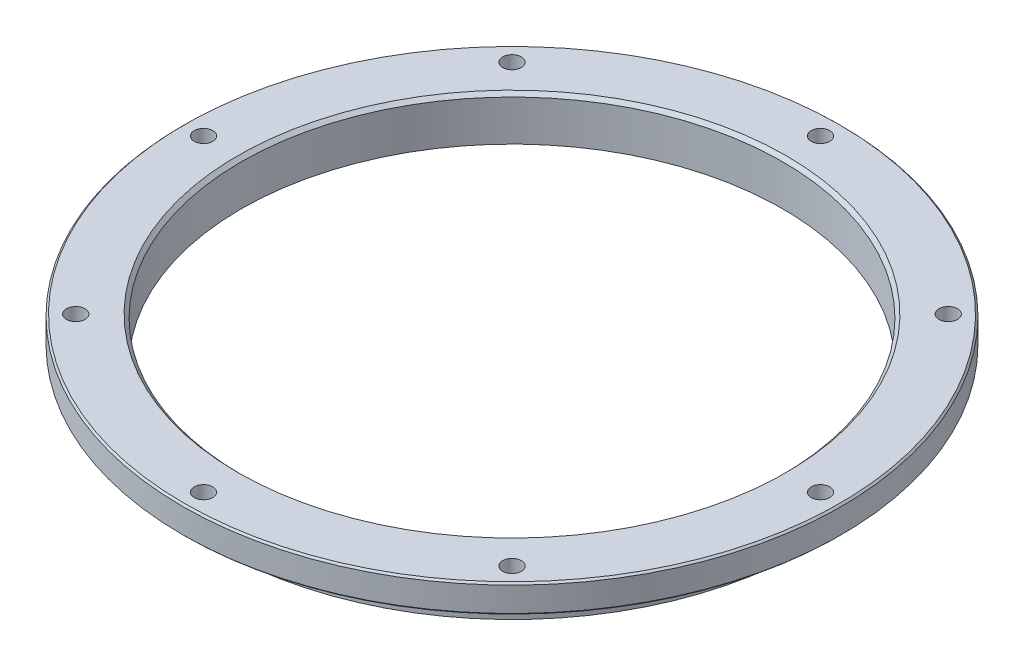
ISO-10303-21;
HEADER;
FILE_DESCRIPTION(('STEP AP214'),'2;1');
FILE_NAME('part.step','',(''),(''),'','','');
FILE_SCHEMA(('AUTOMOTIVE_DESIGN { 1 0 10303 214 1 1 1 1 }'));
ENDSEC;
DATA;
#1=APPLICATION_CONTEXT('core data for automotive mechanical design processes');
#2=APPLICATION_PROTOCOL_DEFINITION('international standard','automotive_design',2000,#1);
#3=PRODUCT_CONTEXT('',#1,'mechanical');
#4=PRODUCT('Part','Part','',(#3));
#5=PRODUCT_RELATED_PRODUCT_CATEGORY('part','',(#4));
#6=PRODUCT_DEFINITION_FORMATION('','',#4);
#7=PRODUCT_DEFINITION_CONTEXT('part definition',#1,'design');
#8=PRODUCT_DEFINITION('design','',#6,#7);
#9=PRODUCT_DEFINITION_SHAPE('','',#8);
#10=(LENGTH_UNIT() NAMED_UNIT(*) SI_UNIT(.MILLI.,.METRE.));
#11=(NAMED_UNIT(*) PLANE_ANGLE_UNIT() SI_UNIT($,.RADIAN.));
#12=(NAMED_UNIT(*) SI_UNIT($,.STERADIAN.) SOLID_ANGLE_UNIT());
#13=UNCERTAINTY_MEASURE_WITH_UNIT(LENGTH_MEASURE(1.E-05),#10,'distance_accuracy_value','');
#14=(GEOMETRIC_REPRESENTATION_CONTEXT(3) GLOBAL_UNCERTAINTY_ASSIGNED_CONTEXT((#13)) GLOBAL_UNIT_ASSIGNED_CONTEXT((#10,
#11,#12)) REPRESENTATION_CONTEXT('',''));
#15=CARTESIAN_POINT('',(0.,0.,0.));
#16=DIRECTION('',(0.,0.,1.));
#17=DIRECTION('',(1.,0.,0.));
#18=AXIS2_PLACEMENT_3D('',#15,#16,#17);
#19=CARTESIAN_POINT('',(-1.384193439547E-12,15.74999507337,-1.021405182655E-12));
#20=DIRECTION('',(0.,-1.,0.));
#21=DIRECTION('',(0.,0.,-1.));
#22=AXIS2_PLACEMENT_3D('',#19,#20,#21);
#23=CONICAL_SURFACE('',#22,93.7499955854,0.785398113577548);
#24=CARTESIAN_POINT('',(0.,15.49999152514,0.));
#25=DIRECTION('',(0.,1.,0.));
#26=DIRECTION('',(1.,0.,0.));
#27=AXIS2_PLACEMENT_3D('',#24,#25,#26);
#28=CIRCLE('',#27,94.);
#29=CARTESIAN_POINT('',(-94.,15.49999152514,0.));
#30=VERTEX_POINT('',#29);
#31=CARTESIAN_POINT('',(-1.39570511940441E-12,15.4999910794989,93.9999995543597));
#32=VERTEX_POINT('',#31);
#33=EDGE_CURVE('E183',#30,#32,#28,.T.);
#34=ORIENTED_EDGE('',*,*,#33,.T.);
#35=DIRECTION('',(0.,0.707106816414536,-0.707106745958557));
#36=VECTOR('',#35,1.);
#37=CARTESIAN_POINT('',(-1.39567450274837E-12,15.74999507337,93.749995585399));
#38=LINE('',#37,#36);
#39=CARTESIAN_POINT('',(-1.39564388603387E-12,15.9999995446702,93.4999911390092));
#40=VERTEX_POINT('',#39);
#41=EDGE_CURVE('E11',#32,#40,#38,.T.);
#42=ORIENTED_EDGE('',*,*,#41,.T.);
#43=CARTESIAN_POINT('',(-1.384178131188E-12,15.99999954467,-1.021405182655E-12));
#44=DIRECTION('',(0.,1.,0.));
#45=DIRECTION('',(1.,0.,0.));
#46=AXIS2_PLACEMENT_3D('',#43,#44,#45);
#47=CIRCLE('',#46,93.49999113901);
#48=EDGE_CURVE('E193',#40,#40,#47,.T.);
#49=ORIENTED_EDGE('',*,*,#48,.F.);
#50=ORIENTED_EDGE('',*,*,#41,.F.);
#51=CARTESIAN_POINT('',(0.,15.49999152514,0.));
#52=DIRECTION('',(0.,1.,0.));
#53=DIRECTION('',(1.,0.,0.));
#54=AXIS2_PLACEMENT_3D('',#51,#52,#53);
#55=CIRCLE('',#54,94.);
#56=EDGE_CURVE('E27',#32,#30,#55,.T.);
#57=ORIENTED_EDGE('',*,*,#56,.T.);
#58=EDGE_LOOP('',(#34,#42,#49,#50,#57));
#59=FACE_BOUND('',#58,.T.);
#60=ADVANCED_FACE('F17',(#59),#23,.T.);
#61=CARTESIAN_POINT('',(0.,-0.8,0.));
#62=DIRECTION('',(0.,1.,0.));
#63=DIRECTION('',(1.,0.,0.));
#64=AXIS2_PLACEMENT_3D('',#61,#62,#63);
#65=CYLINDRICAL_SURFACE('',#64,94.);
#66=ORIENTED_EDGE('',*,*,#33,.F.);
#67=DIRECTION('',(0.,-1.,0.));
#68=VECTOR('',#67,1.);
#69=CARTESIAN_POINT('',(-94.,-0.8,0.));
#70=LINE('',#69,#68);
#71=CARTESIAN_POINT('',(-94.,8.500006914506,0.));
#72=VERTEX_POINT('',#71);
#73=EDGE_CURVE('E252',#30,#72,#70,.T.);
#74=ORIENTED_EDGE('',*,*,#73,.T.);
#75=CARTESIAN_POINT('',(0.,8.500006914506,0.));
#76=DIRECTION('',(0.,1.,0.));
#77=DIRECTION('',(1.,0.,0.));
#78=AXIS2_PLACEMENT_3D('',#75,#76,#77);
#79=CIRCLE('',#78,94.);
#80=CARTESIAN_POINT('',(-1.3114627038843E-12,8.50000721900428,93.999999695505));
#81=VERTEX_POINT('',#80);
#82=EDGE_CURVE('E172',#72,#81,#79,.T.);
#83=ORIENTED_EDGE('',*,*,#82,.T.);
#84=CARTESIAN_POINT('',(0.,8.500006914506,0.));
#85=DIRECTION('',(0.,1.,0.));
#86=DIRECTION('',(1.,0.,0.));
#87=AXIS2_PLACEMENT_3D('',#84,#85,#86);
#88=CIRCLE('',#87,94.);
#89=EDGE_CURVE('E169',#81,#72,#88,.T.);
#90=ORIENTED_EDGE('',*,*,#89,.T.);
#91=ORIENTED_EDGE('',*,*,#73,.F.);
#92=ORIENTED_EDGE('',*,*,#56,.F.);
#93=EDGE_LOOP('',(#66,#74,#83,#90,#91,#92));
#94=FACE_BOUND('',#93,.T.);
#95=ADVANCED_FACE('F379',(#94),#65,.T.);
#96=CARTESIAN_POINT('',(-1.322974383759E-12,8.250003943841,1.284305994886E-12));
#97=DIRECTION('',(0.,1.,0.));
#98=DIRECTION('',(0.,0.,-1.));
#99=AXIS2_PLACEMENT_3D('',#96,#97,#98);
#100=CONICAL_SURFACE('',#99,93.74999644035,0.785398123378794);
#101=ORIENTED_EDGE('',*,*,#82,.F.);
#102=ORIENTED_EDGE('',*,*,#89,.F.);
#103=DIRECTION('',(0.,-0.707106809484009,-0.707106752889085));
#104=VECTOR('',#103,1.);
#105=CARTESIAN_POINT('',(-1.31149332045292E-12,8.250003943841,93.7499964403513));
#106=LINE('',#105,#104);
#107=CARTESIAN_POINT('',(-1.31152393706513E-12,8.00000031281068,93.4999928293306));
#108=VERTEX_POINT('',#107);
#109=EDGE_CURVE('E163',#81,#108,#106,.T.);
#110=ORIENTED_EDGE('',*,*,#109,.T.);
#111=CARTESIAN_POINT('',(-1.322989692066E-12,8.00000031281,1.284305994886E-12));
#112=DIRECTION('',(0.,1.,0.));
#113=DIRECTION('',(1.,0.,0.));
#114=AXIS2_PLACEMENT_3D('',#111,#112,#113);
#115=CIRCLE('',#114,93.49999282933);
#116=EDGE_CURVE('E236',#108,#108,#115,.T.);
#117=ORIENTED_EDGE('',*,*,#116,.T.);
#118=ORIENTED_EDGE('',*,*,#109,.F.);
#119=EDGE_LOOP('',(#101,#102,#110,#117,#118));
#120=FACE_BOUND('',#119,.T.);
#121=ADVANCED_FACE('F377',(#120),#100,.T.);
#122=CARTESIAN_POINT('',(-62.22539674442,16.,62.22539674442));
#123=DIRECTION('',(0.,-1.,0.));
#124=DIRECTION('',(1.,0.,0.));
#125=AXIS2_PLACEMENT_3D('',#122,#123,#124);
#126=CYLINDRICAL_SURFACE('',#125,2.65);
#127=CARTESIAN_POINT('',(-62.22539674442,16.,62.22539674442));
#128=DIRECTION('',(0.,-1.,0.));
#129=DIRECTION('',(1.,0.,0.));
#130=AXIS2_PLACEMENT_3D('',#127,#128,#129);
#131=CIRCLE('',#130,2.65);
#132=CARTESIAN_POINT('',(-64.87539674442,16.,62.22539674442));
#133=VERTEX_POINT('',#132);
#134=EDGE_CURVE('E245',#133,#133,#131,.T.);
#135=ORIENTED_EDGE('',*,*,#134,.F.);
#136=DIRECTION('',(0.,-1.,0.));
#137=VECTOR('',#136,1.);
#138=CARTESIAN_POINT('',(-64.87539674442,16.,62.22539674442));
#139=LINE('',#138,#137);
#140=CARTESIAN_POINT('',(-64.87539674442,8.,62.22539674442));
#141=VERTEX_POINT('',#140);
#142=EDGE_CURVE('E157',#133,#141,#139,.T.);
#143=ORIENTED_EDGE('',*,*,#142,.T.);
#144=CARTESIAN_POINT('',(-62.22539674442,8.,62.22539674442));
#145=DIRECTION('',(0.,-1.,0.));
#146=DIRECTION('',(1.,0.,0.));
#147=AXIS2_PLACEMENT_3D('',#144,#145,#146);
#148=CIRCLE('',#147,2.65);
#149=EDGE_CURVE('E265',#141,#141,#148,.T.);
#150=ORIENTED_EDGE('',*,*,#149,.T.);
#151=ORIENTED_EDGE('',*,*,#142,.F.);
#152=EDGE_LOOP('',(#135,#143,#150,#151));
#153=FACE_BOUND('',#152,.T.);
#154=ADVANCED_FACE('F353',(#153),#126,.F.);
#155=CARTESIAN_POINT('',(-88.,16.,0.));
#156=DIRECTION('',(0.,-1.,0.));
#157=DIRECTION('',(1.,0.,0.));
#158=AXIS2_PLACEMENT_3D('',#155,#156,#157);
#159=CYLINDRICAL_SURFACE('',#158,2.65);
#160=CARTESIAN_POINT('',(-88.,16.,0.));
#161=DIRECTION('',(0.,-1.,0.));
#162=DIRECTION('',(1.,0.,0.));
#163=AXIS2_PLACEMENT_3D('',#160,#161,#162);
#164=CIRCLE('',#163,2.65);
#165=CARTESIAN_POINT('',(-90.65,16.,0.));
#166=VERTEX_POINT('',#165);
#167=EDGE_CURVE('E230',#166,#166,#164,.T.);
#168=ORIENTED_EDGE('',*,*,#167,.F.);
#169=DIRECTION('',(0.,-1.,0.));
#170=VECTOR('',#169,1.);
#171=CARTESIAN_POINT('',(-90.65,16.,0.));
#172=LINE('',#171,#170);
#173=CARTESIAN_POINT('',(-90.65,8.,0.));
#174=VERTEX_POINT('',#173);
#175=EDGE_CURVE('E149',#166,#174,#172,.T.);
#176=ORIENTED_EDGE('',*,*,#175,.T.);
#177=CARTESIAN_POINT('',(-88.,8.,0.));
#178=DIRECTION('',(0.,-1.,0.));
#179=DIRECTION('',(1.,0.,0.));
#180=AXIS2_PLACEMENT_3D('',#177,#178,#179);
#181=CIRCLE('',#180,2.65);
#182=EDGE_CURVE('E285',#174,#174,#181,.T.);
#183=ORIENTED_EDGE('',*,*,#182,.T.);
#184=ORIENTED_EDGE('',*,*,#175,.F.);
#185=EDGE_LOOP('',(#168,#176,#183,#184));
#186=FACE_BOUND('',#185,.T.);
#187=ADVANCED_FACE('F386',(#186),#159,.F.);
#188=CARTESIAN_POINT('',(-62.22539674442,16.,-62.22539674442));
#189=DIRECTION('',(0.,-1.,0.));
#190=DIRECTION('',(1.,0.,0.));
#191=AXIS2_PLACEMENT_3D('',#188,#189,#190);
#192=CYLINDRICAL_SURFACE('',#191,2.65);
#193=CARTESIAN_POINT('',(-62.22539674442,16.,-62.22539674442));
#194=DIRECTION('',(0.,-1.,0.));
#195=DIRECTION('',(1.,0.,0.));
#196=AXIS2_PLACEMENT_3D('',#193,#194,#195);
#197=CIRCLE('',#196,2.65);
#198=CARTESIAN_POINT('',(-64.87539674442,16.,-62.22539674442));
#199=VERTEX_POINT('',#198);
#200=EDGE_CURVE('E147',#199,#199,#197,.T.);
#201=ORIENTED_EDGE('',*,*,#200,.F.);
#202=DIRECTION('',(0.,-1.,0.));
#203=VECTOR('',#202,1.);
#204=CARTESIAN_POINT('',(-64.87539674442,16.,-62.22539674442));
#205=LINE('',#204,#203);
#206=CARTESIAN_POINT('',(-64.87539674442,8.,-62.22539674442));
#207=VERTEX_POINT('',#206);
#208=EDGE_CURVE('E142',#199,#207,#205,.T.);
#209=ORIENTED_EDGE('',*,*,#208,.T.);
#210=CARTESIAN_POINT('',(-62.22539674442,8.,-62.22539674442));
#211=DIRECTION('',(0.,-1.,0.));
#212=DIRECTION('',(1.,0.,0.));
#213=AXIS2_PLACEMENT_3D('',#210,#211,#212);
#214=CIRCLE('',#213,2.65);
#215=EDGE_CURVE('E145',#207,#207,#214,.T.);
#216=ORIENTED_EDGE('',*,*,#215,.T.);
#217=ORIENTED_EDGE('',*,*,#208,.F.);
#218=EDGE_LOOP('',(#201,#209,#216,#217));
#219=FACE_BOUND('',#218,.T.);
#220=ADVANCED_FACE('F143',(#219),#192,.F.);
#221=CARTESIAN_POINT('',(0.,16.,-88.));
#222=DIRECTION('',(0.,-1.,0.));
#223=DIRECTION('',(1.,0.,0.));
#224=AXIS2_PLACEMENT_3D('',#221,#222,#223);
#225=CYLINDRICAL_SURFACE('',#224,2.65);
#226=CARTESIAN_POINT('',(0.,16.,-88.));
#227=DIRECTION('',(0.,-1.,0.));
#228=DIRECTION('',(1.,0.,0.));
#229=AXIS2_PLACEMENT_3D('',#226,#227,#228);
#230=CIRCLE('',#229,2.65);
#231=CARTESIAN_POINT('',(-2.65,16.,-88.));
#232=VERTEX_POINT('',#231);
#233=EDGE_CURVE('E231',#232,#232,#230,.T.);
#234=ORIENTED_EDGE('',*,*,#233,.F.);
#235=DIRECTION('',(0.,-1.,0.));
#236=VECTOR('',#235,1.);
#237=CARTESIAN_POINT('',(-2.65,16.,-88.));
#238=LINE('',#237,#236);
#239=CARTESIAN_POINT('',(-2.65,8.,-88.));
#240=VERTEX_POINT('',#239);
#241=EDGE_CURVE('E150',#232,#240,#238,.T.);
#242=ORIENTED_EDGE('',*,*,#241,.T.);
#243=CARTESIAN_POINT('',(0.,8.,-88.));
#244=DIRECTION('',(0.,-1.,0.));
#245=DIRECTION('',(1.,0.,0.));
#246=AXIS2_PLACEMENT_3D('',#243,#244,#245);
#247=CIRCLE('',#246,2.65);
#248=EDGE_CURVE('E165',#240,#240,#247,.T.);
#249=ORIENTED_EDGE('',*,*,#248,.T.);
#250=ORIENTED_EDGE('',*,*,#241,.F.);
#251=EDGE_LOOP('',(#234,#242,#249,#250));
#252=FACE_BOUND('',#251,.T.);
#253=ADVANCED_FACE('F19',(#252),#225,.F.);
#254=CARTESIAN_POINT('',(62.22539674442,16.,-62.22539674442));
#255=DIRECTION('',(0.,-1.,0.));
#256=DIRECTION('',(1.,0.,0.));
#257=AXIS2_PLACEMENT_3D('',#254,#255,#256);
#258=CYLINDRICAL_SURFACE('',#257,2.65);
#259=CARTESIAN_POINT('',(62.22539674442,16.,-62.22539674442));
#260=DIRECTION('',(0.,-1.,0.));
#261=DIRECTION('',(1.,0.,0.));
#262=AXIS2_PLACEMENT_3D('',#259,#260,#261);
#263=CIRCLE('',#262,2.65);
#264=CARTESIAN_POINT('',(59.57539674442,16.,-62.22539674442));
#265=VERTEX_POINT('',#264);
#266=EDGE_CURVE('E246',#265,#265,#263,.T.);
#267=ORIENTED_EDGE('',*,*,#266,.F.);
#268=DIRECTION('',(0.,-1.,0.));
#269=VECTOR('',#268,1.);
#270=CARTESIAN_POINT('',(59.57539674442,16.,-62.22539674442));
#271=LINE('',#270,#269);
#272=CARTESIAN_POINT('',(59.57539674442,8.,-62.22539674442));
#273=VERTEX_POINT('',#272);
#274=EDGE_CURVE('E159',#265,#273,#271,.T.);
#275=ORIENTED_EDGE('',*,*,#274,.T.);
#276=CARTESIAN_POINT('',(62.22539674442,8.,-62.22539674442));
#277=DIRECTION('',(0.,-1.,0.));
#278=DIRECTION('',(1.,0.,0.));
#279=AXIS2_PLACEMENT_3D('',#276,#277,#278);
#280=CIRCLE('',#279,2.65);
#281=EDGE_CURVE('E168',#273,#273,#280,.T.);
#282=ORIENTED_EDGE('',*,*,#281,.T.);
#283=ORIENTED_EDGE('',*,*,#274,.F.);
#284=EDGE_LOOP('',(#267,#275,#282,#283));
#285=FACE_BOUND('',#284,.T.);
#286=ADVANCED_FACE('F409',(#285),#258,.F.);
#287=CARTESIAN_POINT('',(88.,16.,0.));
#288=DIRECTION('',(0.,-1.,0.));
#289=DIRECTION('',(1.,0.,0.));
#290=AXIS2_PLACEMENT_3D('',#287,#288,#289);
#291=CYLINDRICAL_SURFACE('',#290,2.65);
#292=CARTESIAN_POINT('',(88.,16.,0.));
#293=DIRECTION('',(0.,-1.,0.));
#294=DIRECTION('',(1.,0.,0.));
#295=AXIS2_PLACEMENT_3D('',#292,#293,#294);
#296=CIRCLE('',#295,2.65);
#297=CARTESIAN_POINT('',(85.35,16.,0.));
#298=VERTEX_POINT('',#297);
#299=EDGE_CURVE('E227',#298,#298,#296,.T.);
#300=ORIENTED_EDGE('',*,*,#299,.F.);
#301=DIRECTION('',(0.,-1.,0.));
#302=VECTOR('',#301,1.);
#303=CARTESIAN_POINT('',(85.35,16.,0.));
#304=LINE('',#303,#302);
#305=CARTESIAN_POINT('',(85.35,8.,0.));
#306=VERTEX_POINT('',#305);
#307=EDGE_CURVE('E281',#298,#306,#304,.T.);
#308=ORIENTED_EDGE('',*,*,#307,.T.);
#309=CARTESIAN_POINT('',(88.,8.,0.));
#310=DIRECTION('',(0.,-1.,0.));
#311=DIRECTION('',(1.,0.,0.));
#312=AXIS2_PLACEMENT_3D('',#309,#310,#311);
#313=CIRCLE('',#312,2.65);
#314=EDGE_CURVE('E222',#306,#306,#313,.T.);
#315=ORIENTED_EDGE('',*,*,#314,.T.);
#316=ORIENTED_EDGE('',*,*,#307,.F.);
#317=EDGE_LOOP('',(#300,#308,#315,#316));
#318=FACE_BOUND('',#317,.T.);
#319=ADVANCED_FACE('F412',(#318),#291,.F.);
#320=CARTESIAN_POINT('',(62.22539674442,16.,62.22539674442));
#321=DIRECTION('',(0.,-1.,0.));
#322=DIRECTION('',(1.,0.,0.));
#323=AXIS2_PLACEMENT_3D('',#320,#321,#322);
#324=CYLINDRICAL_SURFACE('',#323,2.65);
#325=CARTESIAN_POINT('',(62.22539674442,16.,62.22539674442));
#326=DIRECTION('',(0.,-1.,0.));
#327=DIRECTION('',(1.,0.,0.));
#328=AXIS2_PLACEMENT_3D('',#325,#326,#327);
#329=CIRCLE('',#328,2.65);
#330=CARTESIAN_POINT('',(59.57539674442,16.,62.22539674442));
#331=VERTEX_POINT('',#330);
#332=EDGE_CURVE('E196',#331,#331,#329,.T.);
#333=ORIENTED_EDGE('',*,*,#332,.F.);
#334=DIRECTION('',(0.,-1.,0.));
#335=VECTOR('',#334,1.);
#336=CARTESIAN_POINT('',(59.57539674442,16.,62.22539674442));
#337=LINE('',#336,#335);
#338=CARTESIAN_POINT('',(59.57539674442,8.,62.22539674442));
#339=VERTEX_POINT('',#338);
#340=EDGE_CURVE('E278',#331,#339,#337,.T.);
#341=ORIENTED_EDGE('',*,*,#340,.T.);
#342=CARTESIAN_POINT('',(62.22539674442,8.,62.22539674442));
#343=DIRECTION('',(0.,-1.,0.));
#344=DIRECTION('',(1.,0.,0.));
#345=AXIS2_PLACEMENT_3D('',#342,#343,#344);
#346=CIRCLE('',#345,2.65);
#347=EDGE_CURVE('E232',#339,#339,#346,.T.);
#348=ORIENTED_EDGE('',*,*,#347,.T.);
#349=ORIENTED_EDGE('',*,*,#340,.F.);
#350=EDGE_LOOP('',(#333,#341,#348,#349));
#351=FACE_BOUND('',#350,.T.);
#352=ADVANCED_FACE('F402',(#351),#324,.F.);
#353=CARTESIAN_POINT('',(0.,0.,0.));
#354=DIRECTION('',(0.,1.,0.));
#355=DIRECTION('',(1.,0.,0.));
#356=AXIS2_PLACEMENT_3D('',#353,#354,#355);
#357=PLANE('',#356);
#358=CARTESIAN_POINT('',(0.,0.,0.));
#359=DIRECTION('',(0.,-1.,0.));
#360=DIRECTION('',(1.,0.,0.));
#361=AXIS2_PLACEMENT_3D('',#358,#359,#360);
#362=CIRCLE('',#361,83.1);
#363=CARTESIAN_POINT('',(83.1,2.53685961126848E-13,0.));
#364=VERTEX_POINT('',#363);
#365=EDGE_CURVE('E218',#364,#364,#362,.T.);
#366=ORIENTED_EDGE('',*,*,#365,.F.);
#367=EDGE_LOOP('',(#366));
#368=FACE_BOUND('',#367,.T.);
#369=CARTESIAN_POINT('',(0.,0.,0.));
#370=DIRECTION('',(0.,1.,0.));
#371=DIRECTION('',(1.,0.,0.));
#372=AXIS2_PLACEMENT_3D('',#369,#370,#371);
#373=CIRCLE('',#372,84.1);
#374=CARTESIAN_POINT('',(-84.1,0.,0.));
#375=VERTEX_POINT('',#374);
#376=EDGE_CURVE('E191',#375,#375,#373,.T.);
#377=ORIENTED_EDGE('',*,*,#376,.F.);
#378=EDGE_LOOP('',(#377));
#379=FACE_BOUND('',#378,.T.);
#380=ADVANCED_FACE('F399',(#368,#379),#357,.F.);
#381=CARTESIAN_POINT('',(0.,-0.8,0.));
#382=DIRECTION('',(0.,1.,0.));
#383=DIRECTION('',(1.,0.,0.));
#384=AXIS2_PLACEMENT_3D('',#381,#382,#383);
#385=CYLINDRICAL_SURFACE('',#384,84.1);
#386=CARTESIAN_POINT('',(0.,8.,0.));
#387=DIRECTION('',(0.,1.,0.));
#388=DIRECTION('',(1.,0.,0.));
#389=AXIS2_PLACEMENT_3D('',#386,#387,#388);
#390=CIRCLE('',#389,84.1);
#391=CARTESIAN_POINT('',(-84.1,8.,0.));
#392=VERTEX_POINT('',#391);
#393=EDGE_CURVE('E260',#392,#392,#390,.T.);
#394=ORIENTED_EDGE('',*,*,#393,.F.);
#395=DIRECTION('',(0.,-1.,0.));
#396=VECTOR('',#395,1.);
#397=CARTESIAN_POINT('',(-84.1,-0.8,0.));
#398=LINE('',#397,#396);
#399=EDGE_CURVE('E264',#392,#375,#398,.T.);
#400=ORIENTED_EDGE('',*,*,#399,.T.);
#401=ORIENTED_EDGE('',*,*,#376,.T.);
#402=ORIENTED_EDGE('',*,*,#399,.F.);
#403=EDGE_LOOP('',(#394,#400,#401,#402));
#404=FACE_BOUND('',#403,.T.);
#405=ADVANCED_FACE('F358',(#404),#385,.T.);
#406=CARTESIAN_POINT('',(0.,8.,0.));
#407=DIRECTION('',(0.,1.,0.));
#408=DIRECTION('',(1.,0.,0.));
#409=AXIS2_PLACEMENT_3D('',#406,#407,#408);
#410=PLANE('',#409);
#411=ORIENTED_EDGE('',*,*,#393,.T.);
#412=EDGE_LOOP('',(#411));
#413=FACE_BOUND('',#412,.T.);
#414=ORIENTED_EDGE('',*,*,#149,.F.);
#415=EDGE_LOOP('',(#414));
#416=FACE_BOUND('',#415,.T.);
#417=ORIENTED_EDGE('',*,*,#182,.F.);
#418=EDGE_LOOP('',(#417));
#419=FACE_BOUND('',#418,.T.);
#420=ORIENTED_EDGE('',*,*,#215,.F.);
#421=EDGE_LOOP('',(#420));
#422=FACE_BOUND('',#421,.T.);
#423=ORIENTED_EDGE('',*,*,#248,.F.);
#424=EDGE_LOOP('',(#423));
#425=FACE_BOUND('',#424,.T.);
#426=ORIENTED_EDGE('',*,*,#281,.F.);
#427=EDGE_LOOP('',(#426));
#428=FACE_BOUND('',#427,.T.);
#429=ORIENTED_EDGE('',*,*,#314,.F.);
#430=EDGE_LOOP('',(#429));
#431=FACE_BOUND('',#430,.T.);
#432=ORIENTED_EDGE('',*,*,#347,.F.);
#433=EDGE_LOOP('',(#432));
#434=FACE_BOUND('',#433,.T.);
#435=CARTESIAN_POINT('',(0.,8.,88.));
#436=DIRECTION('',(0.,-1.,0.));
#437=DIRECTION('',(1.,0.,0.));
#438=AXIS2_PLACEMENT_3D('',#435,#436,#437);
#439=CIRCLE('',#438,2.65);
#440=CARTESIAN_POINT('',(-2.65,8.,88.));
#441=VERTEX_POINT('',#440);
#442=EDGE_CURVE('E259',#441,#441,#439,.T.);
#443=ORIENTED_EDGE('',*,*,#442,.F.);
#444=EDGE_LOOP('',(#443));
#445=FACE_BOUND('',#444,.T.);
#446=ORIENTED_EDGE('',*,*,#116,.F.);
#447=EDGE_LOOP('',(#446));
#448=FACE_BOUND('',#447,.T.);
#449=ADVANCED_FACE('F355',(#413,#416,#419,#422,#425,#428,#431,#434,#445,#448),#410,.F.);
#450=CARTESIAN_POINT('',(0.,16.,88.));
#451=DIRECTION('',(0.,-1.,0.));
#452=DIRECTION('',(1.,0.,0.));
#453=AXIS2_PLACEMENT_3D('',#450,#451,#452);
#454=CYLINDRICAL_SURFACE('',#453,2.65);
#455=CARTESIAN_POINT('',(0.,16.,88.));
#456=DIRECTION('',(0.,-1.,0.));
#457=DIRECTION('',(1.,0.,0.));
#458=AXIS2_PLACEMENT_3D('',#455,#456,#457);
#459=CIRCLE('',#458,2.65);
#460=CARTESIAN_POINT('',(-2.65,16.,88.));
#461=VERTEX_POINT('',#460);
#462=EDGE_CURVE('E240',#461,#461,#459,.T.);
#463=ORIENTED_EDGE('',*,*,#462,.F.);
#464=DIRECTION('',(0.,-1.,0.));
#465=VECTOR('',#464,1.);
#466=CARTESIAN_POINT('',(-2.65,16.,88.));
#467=LINE('',#466,#465);
#468=EDGE_CURVE('E244',#461,#441,#467,.T.);
#469=ORIENTED_EDGE('',*,*,#468,.T.);
#470=ORIENTED_EDGE('',*,*,#442,.T.);
#471=ORIENTED_EDGE('',*,*,#468,.F.);
#472=EDGE_LOOP('',(#463,#469,#470,#471));
#473=FACE_BOUND('',#472,.T.);
#474=ADVANCED_FACE('F315',(#473),#454,.F.);
#475=CARTESIAN_POINT('',(0.,16.,0.));
#476=DIRECTION('',(0.,1.,0.));
#477=DIRECTION('',(1.,0.,0.));
#478=AXIS2_PLACEMENT_3D('',#475,#476,#477);
#479=PLANE('',#478);
#480=ORIENTED_EDGE('',*,*,#462,.T.);
#481=EDGE_LOOP('',(#480));
#482=FACE_BOUND('',#481,.T.);
#483=CARTESIAN_POINT('',(8.858338061661E-13,16.,3.321787289678E-13));
#484=DIRECTION('',(0.,1.,0.));
#485=DIRECTION('',(0.,0.,-1.));
#486=AXIS2_PLACEMENT_3D('',#483,#484,#485);
#487=CIRCLE('',#486,78.2500201846479);
#488=CARTESIAN_POINT('',(8.95416669841335E-13,16.,78.2500201846482));
#489=VERTEX_POINT('',#488);
#490=EDGE_CURVE('E197',#489,#489,#487,.T.);
#491=ORIENTED_EDGE('',*,*,#490,.F.);
#492=EDGE_LOOP('',(#491));
#493=FACE_BOUND('',#492,.T.);
#494=ORIENTED_EDGE('',*,*,#134,.T.);
#495=EDGE_LOOP('',(#494));
#496=FACE_BOUND('',#495,.T.);
#497=ORIENTED_EDGE('',*,*,#167,.T.);
#498=EDGE_LOOP('',(#497));
#499=FACE_BOUND('',#498,.T.);
#500=ORIENTED_EDGE('',*,*,#200,.T.);
#501=EDGE_LOOP('',(#500));
#502=FACE_BOUND('',#501,.T.);
#503=ORIENTED_EDGE('',*,*,#233,.T.);
#504=EDGE_LOOP('',(#503));
#505=FACE_BOUND('',#504,.T.);
#506=ORIENTED_EDGE('',*,*,#266,.T.);
#507=EDGE_LOOP('',(#506));
#508=FACE_BOUND('',#507,.T.);
#509=ORIENTED_EDGE('',*,*,#299,.T.);
#510=EDGE_LOOP('',(#509));
#511=FACE_BOUND('',#510,.T.);
#512=ORIENTED_EDGE('',*,*,#332,.T.);
#513=EDGE_LOOP('',(#512));
#514=FACE_BOUND('',#513,.T.);
#515=ORIENTED_EDGE('',*,*,#48,.T.);
#516=EDGE_LOOP('',(#515));
#517=FACE_BOUND('',#516,.T.);
#518=ADVANCED_FACE('F318',(#482,#493,#496,#499,#502,#505,#508,#511,#514,#517),#479,.T.);
#519=CARTESIAN_POINT('',(8.858338061661E-13,15.49999006829,3.321787289678E-13));
#520=DIRECTION('',(0.,1.,0.));
#521=DIRECTION('',(0.,0.,-1.));
#522=AXIS2_PLACEMENT_3D('',#519,#520,#521);
#523=CONICAL_SURFACE('',#522,77.75001012396,0.785398292372742);
#524=CARTESIAN_POINT('',(0.,14.9999800733079,0.));
#525=DIRECTION('',(0.,1.,0.));
#526=DIRECTION('',(1.,0.,0.));
#527=AXIS2_PLACEMENT_3D('',#524,#525,#526);
#528=CIRCLE('',#527,77.25);
#529=CARTESIAN_POINT('',(-77.25,14.9999800733079,0.));
#530=VERTEX_POINT('',#529);
#531=CARTESIAN_POINT('',(8.95294202689513E-13,14.9999800733074,77.25));
#532=VERTEX_POINT('',#531);
#533=EDGE_CURVE('E198',#530,#532,#528,.T.);
#534=ORIENTED_EDGE('',*,*,#533,.F.);
#535=CARTESIAN_POINT('',(0.,14.9999800733079,0.));
#536=DIRECTION('',(0.,1.,0.));
#537=DIRECTION('',(1.,0.,0.));
#538=AXIS2_PLACEMENT_3D('',#535,#536,#537);
#539=CIRCLE('',#538,77.25);
#540=EDGE_CURVE('E201',#532,#530,#539,.T.);
#541=ORIENTED_EDGE('',*,*,#540,.F.);
#542=DIRECTION('',(0.,0.707106689987237,0.707106872385847));
#543=VECTOR('',#542,1.);
#544=CARTESIAN_POINT('',(8.95355436269298E-13,15.49999006829,77.7500101239603));
#545=LINE('',#544,#543);
#546=EDGE_CURVE('E210',#532,#489,#545,.T.);
#547=ORIENTED_EDGE('',*,*,#546,.T.);
#548=ORIENTED_EDGE('',*,*,#490,.T.);
#549=ORIENTED_EDGE('',*,*,#546,.F.);
#550=EDGE_LOOP('',(#534,#541,#547,#548,#549));
#551=FACE_BOUND('',#550,.T.);
#552=ADVANCED_FACE('F321',(#551),#523,.F.);
#553=CARTESIAN_POINT('',(0.,-0.8,0.));
#554=DIRECTION('',(0.,1.,0.));
#555=DIRECTION('',(1.,0.,0.));
#556=AXIS2_PLACEMENT_3D('',#553,#554,#555);
#557=CYLINDRICAL_SURFACE('',#556,77.25);
#558=CARTESIAN_POINT('',(0.,3.377499074759,0.));
#559=DIRECTION('',(0.,1.,0.));
#560=DIRECTION('',(1.,0.,0.));
#561=AXIS2_PLACEMENT_3D('',#558,#559,#560);
#562=CIRCLE('',#561,77.25);
#563=CARTESIAN_POINT('',(-77.25,3.377499074759,0.));
#564=VERTEX_POINT('',#563);
#565=CARTESIAN_POINT('',(77.25,3.37749907475949,0.));
#566=VERTEX_POINT('',#565);
#567=EDGE_CURVE('E274',#564,#566,#562,.T.);
#568=ORIENTED_EDGE('',*,*,#567,.F.);
#569=DIRECTION('',(0.,1.,0.));
#570=VECTOR('',#569,1.);
#571=CARTESIAN_POINT('',(-77.25,-0.8,0.));
#572=LINE('',#571,#570);
#573=EDGE_CURVE('E202',#564,#530,#572,.T.);
#574=ORIENTED_EDGE('',*,*,#573,.T.);
#575=ORIENTED_EDGE('',*,*,#533,.T.);
#576=ORIENTED_EDGE('',*,*,#540,.T.);
#577=ORIENTED_EDGE('',*,*,#573,.F.);
#578=CARTESIAN_POINT('',(0.,3.377499074759,0.));
#579=DIRECTION('',(0.,1.,0.));
#580=DIRECTION('',(1.,0.,0.));
#581=AXIS2_PLACEMENT_3D('',#578,#579,#580);
#582=CIRCLE('',#581,77.25);
#583=EDGE_CURVE('E211',#566,#564,#582,.T.);
#584=ORIENTED_EDGE('',*,*,#583,.F.);
#585=EDGE_LOOP('',(#568,#574,#575,#576,#577,#584));
#586=FACE_BOUND('',#585,.T.);
#587=ADVANCED_FACE('F397',(#586),#557,.F.);
#588=CARTESIAN_POINT('',(0.,1.68874953738,0.));
#589=DIRECTION('',(0.,-1.,0.));
#590=DIRECTION('',(-1.,0.,0.));
#591=AXIS2_PLACEMENT_3D('',#588,#589,#590);
#592=CONICAL_SURFACE('',#591,80.175,1.0471975511966);
#593=ORIENTED_EDGE('',*,*,#567,.T.);
#594=DIRECTION('',(0.866025403784438,-0.5,0.));
#595=VECTOR('',#594,1.);
#596=CARTESIAN_POINT('',(80.175,1.68874953738,0.));
#597=LINE('',#596,#595);
#598=EDGE_CURVE('E238',#566,#364,#597,.T.);
#599=ORIENTED_EDGE('',*,*,#598,.T.);
#600=ORIENTED_EDGE('',*,*,#365,.T.);
#601=ORIENTED_EDGE('',*,*,#598,.F.);
#602=ORIENTED_EDGE('',*,*,#583,.T.);
#603=EDGE_LOOP('',(#593,#599,#600,#601,#602));
#604=FACE_BOUND('',#603,.T.);
#605=ADVANCED_FACE('F394',(#604),#592,.F.);
#606=CLOSED_SHELL('',(#60,#95,#121,#154,#187,#220,#253,#286,#319,#352,#380,#405,#449,#474,#518,
#552,#587,#605));
#607=MANIFOLD_SOLID_BREP('B1',#606);
#608=ADVANCED_BREP_SHAPE_REPRESENTATION('',(#18,#607),#14);
#609=SHAPE_DEFINITION_REPRESENTATION(#9,#608);
ENDSEC;
END-ISO-10303-21;
